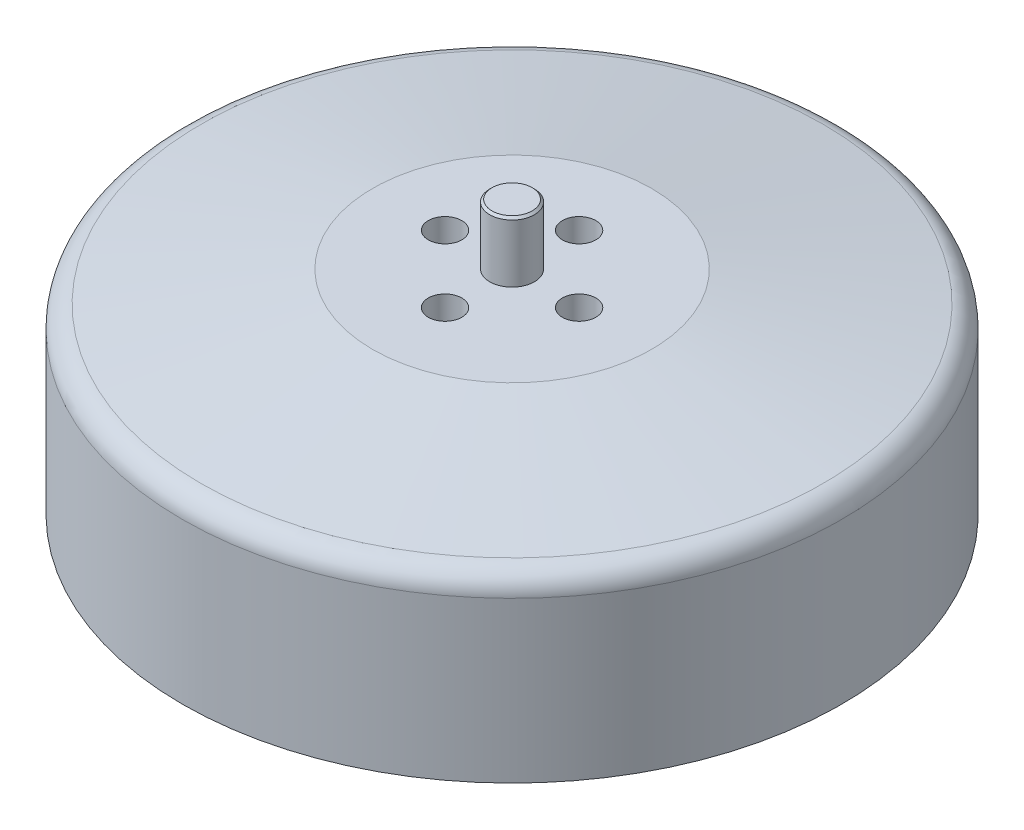
ISO-10303-21;
HEADER;
FILE_DESCRIPTION(('STEP AP214'),'2;1');
FILE_NAME('part.step','',(''),(''),'','','');
FILE_SCHEMA(('AUTOMOTIVE_DESIGN { 1 0 10303 214 1 1 1 1 }'));
ENDSEC;
DATA;
#1=APPLICATION_CONTEXT('core data for automotive mechanical design processes');
#2=APPLICATION_PROTOCOL_DEFINITION('international standard','automotive_design',2000,#1);
#3=PRODUCT_CONTEXT('',#1,'mechanical');
#4=PRODUCT('Part','Part','',(#3));
#5=PRODUCT_RELATED_PRODUCT_CATEGORY('part','',(#4));
#6=PRODUCT_DEFINITION_FORMATION('','',#4);
#7=PRODUCT_DEFINITION_CONTEXT('part definition',#1,'design');
#8=PRODUCT_DEFINITION('design','',#6,#7);
#9=PRODUCT_DEFINITION_SHAPE('','',#8);
#10=(LENGTH_UNIT() NAMED_UNIT(*) SI_UNIT(.MILLI.,.METRE.));
#11=(NAMED_UNIT(*) PLANE_ANGLE_UNIT() SI_UNIT($,.RADIAN.));
#12=(NAMED_UNIT(*) SI_UNIT($,.STERADIAN.) SOLID_ANGLE_UNIT());
#13=UNCERTAINTY_MEASURE_WITH_UNIT(LENGTH_MEASURE(1.E-05),#10,'distance_accuracy_value','');
#14=(GEOMETRIC_REPRESENTATION_CONTEXT(3) GLOBAL_UNCERTAINTY_ASSIGNED_CONTEXT((#13)) GLOBAL_UNIT_ASSIGNED_CONTEXT((#10,
#11,#12)) REPRESENTATION_CONTEXT('',''));
#15=CARTESIAN_POINT('',(0.,0.,0.));
#16=DIRECTION('',(0.,0.,1.));
#17=DIRECTION('',(1.,0.,0.));
#18=AXIS2_PLACEMENT_3D('',#15,#16,#17);
#19=CARTESIAN_POINT('',(0.,0.,0.));
#20=DIRECTION('',(0.,1.,0.));
#21=DIRECTION('',(0.,0.,1.));
#22=AXIS2_PLACEMENT_3D('',#19,#20,#21);
#23=PLANE('',#22);
#24=CARTESIAN_POINT('',(0.,0.,0.));
#25=DIRECTION('',(0.,1.,0.));
#26=DIRECTION('',(0.,0.,1.));
#27=AXIS2_PLACEMENT_3D('',#24,#25,#26);
#28=CIRCLE('',#27,29.5);
#29=CARTESIAN_POINT('',(0.,0.,29.5));
#30=VERTEX_POINT('',#29);
#31=EDGE_CURVE('E56',#30,#30,#28,.T.);
#32=ORIENTED_EDGE('',*,*,#31,.F.);
#33=EDGE_LOOP('',(#32));
#34=FACE_BOUND('',#33,.T.);
#35=CARTESIAN_POINT('',(0.,0.,0.));
#36=DIRECTION('',(0.,1.,0.));
#37=DIRECTION('',(0.,0.,1.));
#38=AXIS2_PLACEMENT_3D('',#35,#36,#37);
#39=CIRCLE('',#38,27.5);
#40=CARTESIAN_POINT('',(0.,0.,27.5));
#41=VERTEX_POINT('',#40);
#42=EDGE_CURVE('E59',#41,#41,#39,.T.);
#43=ORIENTED_EDGE('',*,*,#42,.T.);
#44=EDGE_LOOP('',(#43));
#45=FACE_BOUND('',#44,.T.);
#46=ADVANCED_FACE('F30',(#34,#45),#23,.F.);
#47=CARTESIAN_POINT('',(0.,14.,0.));
#48=DIRECTION('',(0.,-1.,0.));
#49=DIRECTION('',(0.,0.,-1.));
#50=AXIS2_PLACEMENT_3D('',#47,#48,#49);
#51=CYLINDRICAL_SURFACE('',#50,29.5);
#52=CARTESIAN_POINT('',(0.,14.3218007376454,0.));
#53=DIRECTION('',(0.,1.,0.));
#54=DIRECTION('',(0.,0.,1.));
#55=AXIS2_PLACEMENT_3D('',#52,#53,#54);
#56=CIRCLE('',#55,29.5);
#57=CARTESIAN_POINT('',(0.,14.3218007376454,29.5));
#58=VERTEX_POINT('',#57);
#59=EDGE_CURVE('E50',#58,#58,#56,.F.);
#60=ORIENTED_EDGE('',*,*,#59,.T.);
#61=EDGE_LOOP('',(#60));
#62=FACE_BOUND('',#61,.T.);
#63=ORIENTED_EDGE('',*,*,#31,.T.);
#64=EDGE_LOOP('',(#63));
#65=FACE_BOUND('',#64,.T.);
#66=ADVANCED_FACE('F114',(#62,#65),#51,.T.);
#67=CARTESIAN_POINT('',(0.,14.,0.));
#68=DIRECTION('',(0.,-1.,0.));
#69=DIRECTION('',(0.,0.,-1.));
#70=AXIS2_PLACEMENT_3D('',#67,#68,#69);
#71=CYLINDRICAL_SURFACE('',#70,27.5);
#72=CARTESIAN_POINT('',(0.,14.,0.));
#73=DIRECTION('',(0.,1.,0.));
#74=DIRECTION('',(0.,0.,1.));
#75=AXIS2_PLACEMENT_3D('',#72,#73,#74);
#76=CIRCLE('',#75,27.5);
#77=CARTESIAN_POINT('',(0.,14.,27.5));
#78=VERTEX_POINT('',#77);
#79=EDGE_CURVE('E62',#78,#78,#76,.T.);
#80=ORIENTED_EDGE('',*,*,#79,.T.);
#81=EDGE_LOOP('',(#80));
#82=FACE_BOUND('',#81,.T.);
#83=ORIENTED_EDGE('',*,*,#42,.F.);
#84=EDGE_LOOP('',(#83));
#85=FACE_BOUND('',#84,.T.);
#86=ADVANCED_FACE('F108',(#82,#85),#71,.F.);
#87=CARTESIAN_POINT('',(0.,14.,0.));
#88=DIRECTION('',(0.,1.,0.));
#89=DIRECTION('',(0.,0.,1.));
#90=AXIS2_PLACEMENT_3D('',#87,#88,#89);
#91=PLANE('',#90);
#92=CARTESIAN_POINT('',(-5.99999999999983,14.,1.70530256582424E-13));
#93=DIRECTION('',(0.,1.,0.));
#94=DIRECTION('',(0.,0.,1.));
#95=AXIS2_PLACEMENT_3D('',#92,#93,#94);
#96=CIRCLE('',#95,1.50000000000027);
#97=CARTESIAN_POINT('',(-5.99999999999983,14.,1.50000000000044));
#98=VERTEX_POINT('',#97);
#99=EDGE_CURVE('E84',#98,#98,#96,.T.);
#100=ORIENTED_EDGE('',*,*,#99,.T.);
#101=EDGE_LOOP('',(#100));
#102=FACE_BOUND('',#101,.T.);
#103=CARTESIAN_POINT('',(3.39590937005871E-13,14.,6.));
#104=DIRECTION('',(0.,1.,0.));
#105=DIRECTION('',(0.,0.,1.));
#106=AXIS2_PLACEMENT_3D('',#103,#104,#105);
#107=CIRCLE('',#106,1.50000000000036);
#108=CARTESIAN_POINT('',(3.39590937005871E-13,14.,7.50000000000037));
#109=VERTEX_POINT('',#108);
#110=EDGE_CURVE('E78',#109,#109,#107,.T.);
#111=ORIENTED_EDGE('',*,*,#110,.T.);
#112=EDGE_LOOP('',(#111));
#113=FACE_BOUND('',#112,.T.);
#114=CARTESIAN_POINT('',(6.00000000000017,14.,-1.69795468502936E-13));
#115=DIRECTION('',(0.,1.,0.));
#116=DIRECTION('',(0.,0.,1.));
#117=AXIS2_PLACEMENT_3D('',#114,#115,#116);
#118=CIRCLE('',#117,1.50000000000013);
#119=CARTESIAN_POINT('',(6.00000000000017,14.,1.49999999999996));
#120=VERTEX_POINT('',#119);
#121=EDGE_CURVE('E72',#120,#120,#118,.T.);
#122=ORIENTED_EDGE('',*,*,#121,.T.);
#123=EDGE_LOOP('',(#122));
#124=FACE_BOUND('',#123,.T.);
#125=CARTESIAN_POINT('',(0.,14.,-6.));
#126=DIRECTION('',(0.,1.,0.));
#127=DIRECTION('',(0.,0.,1.));
#128=AXIS2_PLACEMENT_3D('',#125,#126,#127);
#129=CIRCLE('',#128,1.5);
#130=CARTESIAN_POINT('',(0.,14.,-4.5));
#131=VERTEX_POINT('',#130);
#132=EDGE_CURVE('E66',#131,#131,#129,.T.);
#133=ORIENTED_EDGE('',*,*,#132,.T.);
#134=EDGE_LOOP('',(#133));
#135=FACE_BOUND('',#134,.T.);
#136=ORIENTED_EDGE('',*,*,#79,.F.);
#137=EDGE_LOOP('',(#136));
#138=FACE_BOUND('',#137,.T.);
#139=ADVANCED_FACE('F96',(#102,#113,#124,#135,#138),#91,.F.);
#140=CARTESIAN_POINT('',(0.,19.,0.));
#141=DIRECTION('',(0.,1.,0.));
#142=DIRECTION('',(0.,0.,1.));
#143=AXIS2_PLACEMENT_3D('',#140,#141,#142);
#144=PLANE('',#143);
#145=CARTESIAN_POINT('',(0.,19.,0.));
#146=DIRECTION('',(0.,1.,0.));
#147=DIRECTION('',(0.,0.,1.));
#148=AXIS2_PLACEMENT_3D('',#145,#146,#147);
#149=CIRCLE('',#148,2.);
#150=CARTESIAN_POINT('',(0.,19.,-2.));
#151=VERTEX_POINT('',#150);
#152=EDGE_CURVE('E41',#151,#151,#149,.T.);
#153=ORIENTED_EDGE('',*,*,#152,.F.);
#154=EDGE_LOOP('',(#153));
#155=FACE_BOUND('',#154,.T.);
#156=CARTESIAN_POINT('',(0.,19.,0.));
#157=DIRECTION('',(0.,1.,0.));
#158=DIRECTION('',(0.,0.,1.));
#159=AXIS2_PLACEMENT_3D('',#156,#157,#158);
#160=CIRCLE('',#159,12.4861545411469);
#161=CARTESIAN_POINT('',(0.,19.,12.4861545411469));
#162=VERTEX_POINT('',#161);
#163=EDGE_CURVE('E53',#162,#162,#160,.T.);
#164=ORIENTED_EDGE('',*,*,#163,.T.);
#165=EDGE_LOOP('',(#164));
#166=FACE_BOUND('',#165,.T.);
#167=CARTESIAN_POINT('',(3.39590937005871E-13,19.,6.));
#168=DIRECTION('',(0.,1.,0.));
#169=DIRECTION('',(0.,0.,1.));
#170=AXIS2_PLACEMENT_3D('',#167,#168,#169);
#171=CIRCLE('',#170,1.50000000000036);
#172=CARTESIAN_POINT('',(3.39590937005871E-13,19.,7.50000000000037));
#173=VERTEX_POINT('',#172);
#174=EDGE_CURVE('E75',#173,#173,#171,.T.);
#175=ORIENTED_EDGE('',*,*,#174,.F.);
#176=EDGE_LOOP('',(#175));
#177=FACE_BOUND('',#176,.T.);
#178=CARTESIAN_POINT('',(0.,19.,-6.));
#179=DIRECTION('',(0.,1.,0.));
#180=DIRECTION('',(0.,0.,1.));
#181=AXIS2_PLACEMENT_3D('',#178,#179,#180);
#182=CIRCLE('',#181,1.5);
#183=CARTESIAN_POINT('',(0.,19.,-4.5));
#184=VERTEX_POINT('',#183);
#185=EDGE_CURVE('E65',#184,#184,#182,.T.);
#186=ORIENTED_EDGE('',*,*,#185,.F.);
#187=EDGE_LOOP('',(#186));
#188=FACE_BOUND('',#187,.T.);
#189=CARTESIAN_POINT('',(6.00000000000017,19.,-1.69795468502936E-13));
#190=DIRECTION('',(0.,1.,0.));
#191=DIRECTION('',(0.,0.,1.));
#192=AXIS2_PLACEMENT_3D('',#189,#190,#191);
#193=CIRCLE('',#192,1.50000000000013);
#194=CARTESIAN_POINT('',(6.00000000000017,19.,1.49999999999996));
#195=VERTEX_POINT('',#194);
#196=EDGE_CURVE('E69',#195,#195,#193,.T.);
#197=ORIENTED_EDGE('',*,*,#196,.F.);
#198=EDGE_LOOP('',(#197));
#199=FACE_BOUND('',#198,.T.);
#200=CARTESIAN_POINT('',(-5.99999999999983,19.,1.70530256582424E-13));
#201=DIRECTION('',(0.,1.,0.));
#202=DIRECTION('',(0.,0.,1.));
#203=AXIS2_PLACEMENT_3D('',#200,#201,#202);
#204=CIRCLE('',#203,1.50000000000027);
#205=CARTESIAN_POINT('',(-5.99999999999983,19.,1.50000000000044));
#206=VERTEX_POINT('',#205);
#207=EDGE_CURVE('E81',#206,#206,#204,.T.);
#208=ORIENTED_EDGE('',*,*,#207,.F.);
#209=EDGE_LOOP('',(#208));
#210=FACE_BOUND('',#209,.T.);
#211=ADVANCED_FACE('F93',(#155,#166,#177,#188,#199,#210),#144,.T.);
#212=CARTESIAN_POINT('',(0.,19.,-6.));
#213=DIRECTION('',(0.,-1.,0.));
#214=DIRECTION('',(0.,0.,-1.));
#215=AXIS2_PLACEMENT_3D('',#212,#213,#214);
#216=CYLINDRICAL_SURFACE('',#215,1.5);
#217=ORIENTED_EDGE('',*,*,#185,.T.);
#218=EDGE_LOOP('',(#217));
#219=FACE_BOUND('',#218,.T.);
#220=ORIENTED_EDGE('',*,*,#132,.F.);
#221=EDGE_LOOP('',(#220));
#222=FACE_BOUND('',#221,.T.);
#223=ADVANCED_FACE('F95',(#219,#222),#216,.F.);
#224=CARTESIAN_POINT('',(6.00000000000017,19.,-1.69795468502936E-13));
#225=DIRECTION('',(0.,-1.,0.));
#226=DIRECTION('',(0.,0.,-1.));
#227=AXIS2_PLACEMENT_3D('',#224,#225,#226);
#228=CYLINDRICAL_SURFACE('',#227,1.50000000000013);
#229=ORIENTED_EDGE('',*,*,#196,.T.);
#230=EDGE_LOOP('',(#229));
#231=FACE_BOUND('',#230,.T.);
#232=ORIENTED_EDGE('',*,*,#121,.F.);
#233=EDGE_LOOP('',(#232));
#234=FACE_BOUND('',#233,.T.);
#235=ADVANCED_FACE('F104',(#231,#234),#228,.F.);
#236=CARTESIAN_POINT('',(3.39590937005871E-13,19.,6.));
#237=DIRECTION('',(0.,-1.,0.));
#238=DIRECTION('',(0.,0.,-1.));
#239=AXIS2_PLACEMENT_3D('',#236,#237,#238);
#240=CYLINDRICAL_SURFACE('',#239,1.50000000000036);
#241=ORIENTED_EDGE('',*,*,#174,.T.);
#242=EDGE_LOOP('',(#241));
#243=FACE_BOUND('',#242,.T.);
#244=ORIENTED_EDGE('',*,*,#110,.F.);
#245=EDGE_LOOP('',(#244));
#246=FACE_BOUND('',#245,.T.);
#247=ADVANCED_FACE('F152',(#243,#246),#240,.F.);
#248=CARTESIAN_POINT('',(-5.99999999999983,19.,1.70530256582424E-13));
#249=DIRECTION('',(0.,-1.,0.));
#250=DIRECTION('',(0.,0.,-1.));
#251=AXIS2_PLACEMENT_3D('',#248,#249,#250);
#252=CYLINDRICAL_SURFACE('',#251,1.50000000000027);
#253=ORIENTED_EDGE('',*,*,#207,.T.);
#254=EDGE_LOOP('',(#253));
#255=FACE_BOUND('',#254,.T.);
#256=ORIENTED_EDGE('',*,*,#99,.F.);
#257=EDGE_LOOP('',(#256));
#258=FACE_BOUND('',#257,.T.);
#259=ADVANCED_FACE('F90',(#255,#258),#252,.F.);
#260=CARTESIAN_POINT('',(0.,19.,0.));
#261=DIRECTION('',(0.,-1.,0.));
#262=DIRECTION('',(0.,0.,-1.));
#263=AXIS2_PLACEMENT_3D('',#260,#261,#262);
#264=CONICAL_SURFACE('',#263,12.4861545411469,1.39626340159546);
#265=CARTESIAN_POINT('',(0.,16.2914162436699,0.));
#266=DIRECTION('',(0.,-1.,0.));
#267=DIRECTION('',(0.,0.,-1.));
#268=AXIS2_PLACEMENT_3D('',#265,#266,#267);
#269=CIRCLE('',#268,27.8472963553339);
#270=CARTESIAN_POINT('',(0.,16.2914162436699,-27.8472963553339));
#271=VERTEX_POINT('',#270);
#272=EDGE_CURVE('E45',#271,#271,#269,.F.);
#273=ORIENTED_EDGE('',*,*,#272,.T.);
#274=EDGE_LOOP('',(#273));
#275=FACE_BOUND('',#274,.T.);
#276=ORIENTED_EDGE('',*,*,#163,.F.);
#277=EDGE_LOOP('',(#276));
#278=FACE_BOUND('',#277,.T.);
#279=ADVANCED_FACE('F126',(#275,#278),#264,.T.);
#280=CARTESIAN_POINT('',(0.,14.3218007376454,0.));
#281=DIRECTION('',(0.,1.,0.));
#282=DIRECTION('',(0.,0.,1.));
#283=AXIS2_PLACEMENT_3D('',#280,#281,#282);
#284=TOROIDAL_SURFACE('',#283,27.5,2.);
#285=ORIENTED_EDGE('',*,*,#272,.F.);
#286=EDGE_LOOP('',(#285));
#287=FACE_BOUND('',#286,.T.);
#288=ORIENTED_EDGE('',*,*,#59,.F.);
#289=EDGE_LOOP('',(#288));
#290=FACE_BOUND('',#289,.T.);
#291=ADVANCED_FACE('F128',(#287,#290),#284,.T.);
#292=CARTESIAN_POINT('',(0.,24.4,0.));
#293=DIRECTION('',(0.,-1.,0.));
#294=DIRECTION('',(0.,0.,-1.));
#295=AXIS2_PLACEMENT_3D('',#292,#293,#294);
#296=CYLINDRICAL_SURFACE('',#295,2.);
#297=CARTESIAN_POINT('',(0.,24.2,0.));
#298=DIRECTION('',(0.,1.,0.));
#299=DIRECTION('',(0.,0.,1.));
#300=AXIS2_PLACEMENT_3D('',#297,#298,#299);
#301=CIRCLE('',#300,2.);
#302=CARTESIAN_POINT('',(0.,24.2,-2.));
#303=VERTEX_POINT('',#302);
#304=EDGE_CURVE('E10',#303,#303,#301,.F.);
#305=CARTESIAN_POINT('',(0.,24.2,-2.));
#306=CARTESIAN_POINT('',(0.,24.1458333333334,-2.));
#307=CARTESIAN_POINT('',(0.,24.0916666666667,-2.));
#308=CARTESIAN_POINT('',(0.,23.9833333333334,-2.));
#309=CARTESIAN_POINT('',(0.,23.9291666666667,-2.));
#310=CARTESIAN_POINT('',(0.,23.8208333333334,-2.));
#311=CARTESIAN_POINT('',(0.,23.7666666666667,-2.));
#312=CARTESIAN_POINT('',(0.,23.6583333333334,-2.));
#313=CARTESIAN_POINT('',(0.,23.6041666666667,-2.));
#314=CARTESIAN_POINT('',(0.,23.4958333333334,-2.));
#315=CARTESIAN_POINT('',(0.,23.4416666666667,-2.));
#316=CARTESIAN_POINT('',(0.,23.3333333333334,-2.));
#317=CARTESIAN_POINT('',(0.,23.2791666666667,-2.));
#318=CARTESIAN_POINT('',(0.,23.1708333333334,-2.));
#319=CARTESIAN_POINT('',(0.,23.1166666666667,-2.));
#320=CARTESIAN_POINT('',(0.,23.0083333333334,-2.));
#321=CARTESIAN_POINT('',(0.,22.9541666666667,-2.));
#322=CARTESIAN_POINT('',(0.,22.8458333333334,-2.));
#323=CARTESIAN_POINT('',(0.,22.7916666666667,-2.));
#324=CARTESIAN_POINT('',(0.,22.6833333333334,-2.));
#325=CARTESIAN_POINT('',(0.,22.6291666666667,-2.));
#326=CARTESIAN_POINT('',(0.,22.5208333333333,-2.));
#327=CARTESIAN_POINT('',(0.,22.4666666666667,-2.));
#328=CARTESIAN_POINT('',(0.,22.3583333333334,-2.));
#329=CARTESIAN_POINT('',(0.,22.3041666666667,-2.));
#330=CARTESIAN_POINT('',(0.,22.1958333333333,-2.));
#331=CARTESIAN_POINT('',(0.,22.1416666666667,-2.));
#332=CARTESIAN_POINT('',(0.,22.0333333333333,-2.));
#333=CARTESIAN_POINT('',(0.,21.9791666666667,-2.));
#334=CARTESIAN_POINT('',(0.,21.8708333333333,-2.));
#335=CARTESIAN_POINT('',(0.,21.8166666666667,-2.));
#336=CARTESIAN_POINT('',(0.,21.7083333333333,-2.));
#337=CARTESIAN_POINT('',(0.,21.6541666666667,-2.));
#338=CARTESIAN_POINT('',(0.,21.5458333333333,-2.));
#339=CARTESIAN_POINT('',(0.,21.4916666666667,-2.));
#340=CARTESIAN_POINT('',(0.,21.3833333333333,-2.));
#341=CARTESIAN_POINT('',(0.,21.3291666666667,-2.));
#342=CARTESIAN_POINT('',(0.,21.2208333333333,-2.));
#343=CARTESIAN_POINT('',(0.,21.1666666666667,-2.));
#344=CARTESIAN_POINT('',(0.,21.0583333333333,-2.));
#345=CARTESIAN_POINT('',(0.,21.0041666666667,-2.));
#346=CARTESIAN_POINT('',(0.,20.8958333333333,-2.));
#347=CARTESIAN_POINT('',(0.,20.8416666666667,-2.));
#348=CARTESIAN_POINT('',(0.,20.7333333333333,-2.));
#349=CARTESIAN_POINT('',(0.,20.6791666666667,-2.));
#350=CARTESIAN_POINT('',(0.,20.5708333333333,-2.));
#351=CARTESIAN_POINT('',(0.,20.5166666666667,-2.));
#352=CARTESIAN_POINT('',(0.,20.4083333333333,-2.));
#353=CARTESIAN_POINT('',(0.,20.3541666666667,-2.));
#354=CARTESIAN_POINT('',(0.,20.2458333333333,-2.));
#355=CARTESIAN_POINT('',(0.,20.1916666666667,-2.));
#356=CARTESIAN_POINT('',(0.,20.0833333333333,-2.));
#357=CARTESIAN_POINT('',(0.,20.0291666666667,-2.));
#358=CARTESIAN_POINT('',(0.,19.9208333333333,-2.));
#359=CARTESIAN_POINT('',(0.,19.8666666666667,-2.));
#360=CARTESIAN_POINT('',(0.,19.7583333333333,-2.));
#361=CARTESIAN_POINT('',(0.,19.7041666666667,-2.));
#362=CARTESIAN_POINT('',(0.,19.5958333333333,-2.));
#363=CARTESIAN_POINT('',(0.,19.5416666666667,-2.));
#364=CARTESIAN_POINT('',(0.,19.4333333333333,-2.));
#365=CARTESIAN_POINT('',(0.,19.3791666666667,-2.));
#366=CARTESIAN_POINT('',(0.,19.2708333333333,-2.));
#367=CARTESIAN_POINT('',(0.,19.2166666666667,-2.));
#368=CARTESIAN_POINT('',(0.,19.1083333333333,-2.));
#369=CARTESIAN_POINT('',(0.,19.0541666666667,-2.));
#370=CARTESIAN_POINT('',(0.,19.,-2.));
#371=B_SPLINE_CURVE_WITH_KNOTS('',3,(#305,#306,#307,#308,#309,#310,#311,#312,#313,#314,#315,
#316,#317,#318,#319,#320,#321,#322,#323,#324,#325,#326,#327,#328,#329,#330,#331,#332,#333,#334,
#335,#336,#337,#338,#339,#340,#341,#342,#343,#344,#345,#346,#347,#348,#349,#350,#351,#352,#353,
#354,#355,#356,#357,#358,#359,#360,#361,#362,#363,#364,#365,#366,#367,#368,#369,#370),
.UNSPECIFIED.,.F.,.F.,(4,2,2,2,2,2,2,2,2,2,2,2,2,2,2,2,2,2,2,2,2,2,2,2,2,2,2,2,2,2,2,2,4),(0.,
0.162500000000003,0.325000000000002,0.487500000000005,0.650000000000005,0.812500000000008,
0.975000000000007,1.13750000000001,1.30000000000001,1.46250000000001,1.62500000000001,
1.78750000000001,1.95000000000001,2.11250000000001,2.27500000000002,2.43750000000002,
2.60000000000002,2.76250000000002,2.92500000000002,3.08750000000002,3.25000000000002,
3.41250000000002,3.57500000000002,3.73750000000002,3.90000000000002,4.06250000000002,
4.22500000000003,4.38750000000003,4.55000000000003,4.71250000000003,4.87500000000003,
5.03750000000003,5.20000000000003),.UNSPECIFIED.);
#372=EDGE_CURVE('BSEAM131',#303,#151,#371,.T.);
#373=ORIENTED_EDGE('',*,*,#304,.T.);
#374=ORIENTED_EDGE('',*,*,#152,.T.);
#375=ORIENTED_EDGE('',*,*,#372,.T.);
#376=ORIENTED_EDGE('',*,*,#372,.F.);
#377=EDGE_LOOP('',(#373,#375,#374,#376));
#378=FACE_BOUND('',#377,.T.);
#379=ADVANCED_FACE('F131',(#378),#296,.T.);
#380=CARTESIAN_POINT('',(0.,24.4,0.));
#381=DIRECTION('',(0.,1.,0.));
#382=DIRECTION('',(0.,0.,1.));
#383=AXIS2_PLACEMENT_3D('',#380,#381,#382);
#384=PLANE('',#383);
#385=CARTESIAN_POINT('',(0.,24.4,0.));
#386=DIRECTION('',(0.,1.,0.));
#387=DIRECTION('',(0.,0.,1.));
#388=AXIS2_PLACEMENT_3D('',#385,#386,#387);
#389=CIRCLE('',#388,1.80000000000004);
#390=CARTESIAN_POINT('',(0.,24.4,1.80000000000004));
#391=VERTEX_POINT('',#390);
#392=EDGE_CURVE('E37',#391,#391,#389,.T.);
#393=ORIENTED_EDGE('',*,*,#392,.T.);
#394=EDGE_LOOP('',(#393));
#395=FACE_BOUND('',#394,.T.);
#396=ADVANCED_FACE('F135',(#395),#384,.T.);
#397=CARTESIAN_POINT('',(0.,24.4,0.));
#398=DIRECTION('',(0.,-1.,0.));
#399=DIRECTION('',(0.,0.,-1.));
#400=AXIS2_PLACEMENT_3D('',#397,#398,#399);
#401=CONICAL_SURFACE('',#400,1.80000000000004,0.785398163397419);
#402=ORIENTED_EDGE('',*,*,#304,.F.);
#403=EDGE_LOOP('',(#402));
#404=FACE_BOUND('',#403,.T.);
#405=ORIENTED_EDGE('',*,*,#392,.F.);
#406=EDGE_LOOP('',(#405));
#407=FACE_BOUND('',#406,.T.);
#408=ADVANCED_FACE('F32',(#404,#407),#401,.T.);
#409=CLOSED_SHELL('',(#46,#66,#86,#139,#211,#223,#235,#247,#259,#279,#291,#379,#396,#408));
#410=MANIFOLD_SOLID_BREP('B2',#409);
#411=ADVANCED_BREP_SHAPE_REPRESENTATION('',(#18,#410),#14);
#412=SHAPE_DEFINITION_REPRESENTATION(#9,#411);
ENDSEC;
END-ISO-10303-21;
